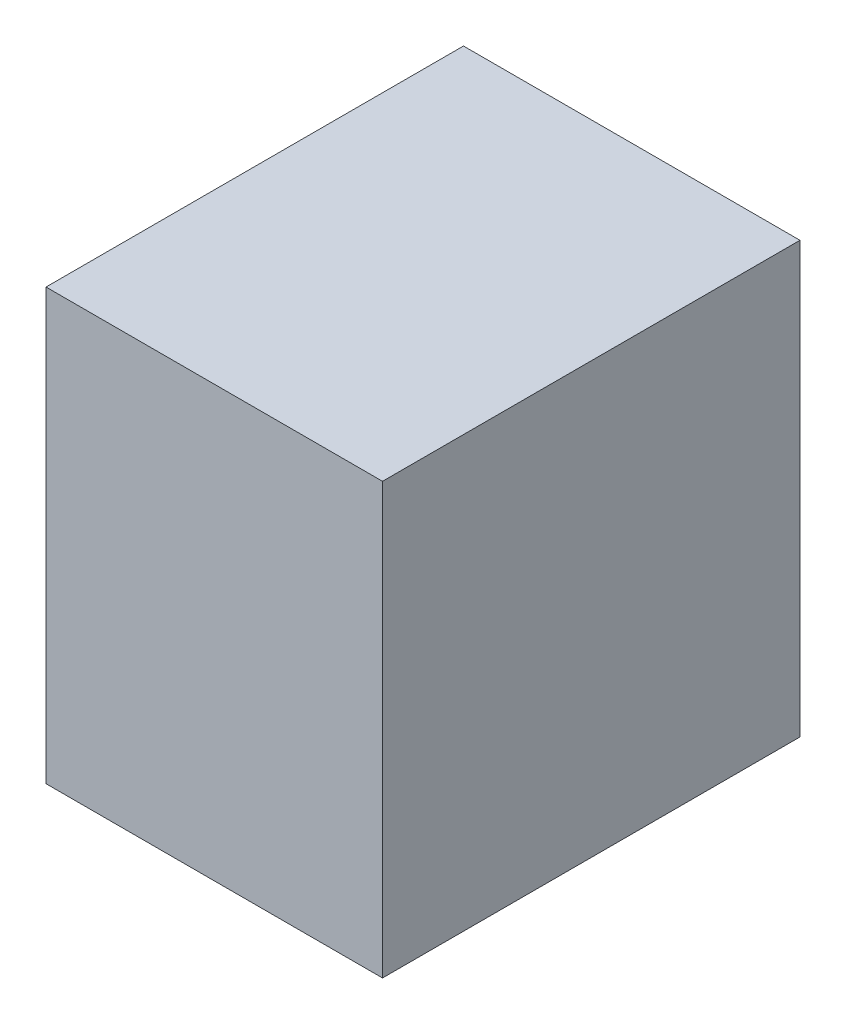
ISO-10303-21;
HEADER;
FILE_DESCRIPTION(('STEP AP214'),'2;1');
FILE_NAME('part.step','',(''),(''),'','','');
FILE_SCHEMA(('AUTOMOTIVE_DESIGN { 1 0 10303 214 1 1 1 1 }'));
ENDSEC;
DATA;
#1=APPLICATION_CONTEXT('core data for automotive mechanical design processes');
#2=APPLICATION_PROTOCOL_DEFINITION('international standard','automotive_design',2000,#1);
#3=PRODUCT_CONTEXT('',#1,'mechanical');
#4=PRODUCT('Part','Part','',(#3));
#5=PRODUCT_RELATED_PRODUCT_CATEGORY('part','',(#4));
#6=PRODUCT_DEFINITION_FORMATION('','',#4);
#7=PRODUCT_DEFINITION_CONTEXT('part definition',#1,'design');
#8=PRODUCT_DEFINITION('design','',#6,#7);
#9=PRODUCT_DEFINITION_SHAPE('','',#8);
#10=(LENGTH_UNIT() NAMED_UNIT(*) SI_UNIT(.MILLI.,.METRE.));
#11=(NAMED_UNIT(*) PLANE_ANGLE_UNIT() SI_UNIT($,.RADIAN.));
#12=(NAMED_UNIT(*) SI_UNIT($,.STERADIAN.) SOLID_ANGLE_UNIT());
#13=UNCERTAINTY_MEASURE_WITH_UNIT(LENGTH_MEASURE(1.E-05),#10,'distance_accuracy_value','');
#14=(GEOMETRIC_REPRESENTATION_CONTEXT(3) GLOBAL_UNCERTAINTY_ASSIGNED_CONTEXT((#13)) GLOBAL_UNIT_ASSIGNED_CONTEXT((#10,
#11,#12)) REPRESENTATION_CONTEXT('',''));
#15=CARTESIAN_POINT('',(0.,0.,0.));
#16=DIRECTION('',(0.,0.,1.));
#17=DIRECTION('',(1.,0.,0.));
#18=AXIS2_PLACEMENT_3D('',#15,#16,#17);
#19=CARTESIAN_POINT('',(0.,0.,0.));
#20=DIRECTION('',(0.,1.,0.));
#21=DIRECTION('',(0.,0.,1.));
#22=AXIS2_PLACEMENT_3D('',#19,#20,#21);
#23=PLANE('',#22);
#24=DIRECTION('',(1.,0.,0.));
#25=VECTOR('',#24,1.);
#26=CARTESIAN_POINT('',(0.,0.,16.1586938369327));
#27=LINE('',#26,#25);
#28=CARTESIAN_POINT('',(-41.0624220629294,0.,16.1586938369327));
#29=VERTEX_POINT('',#28);
#30=CARTESIAN_POINT('',(-21.5061909323463,0.,16.1586938369327));
#31=VERTEX_POINT('',#30);
#32=EDGE_CURVE('E133',#29,#31,#27,.T.);
#33=ORIENTED_EDGE('',*,*,#32,.F.);
#34=DIRECTION('',(0.,0.,1.));
#35=VECTOR('',#34,1.);
#36=CARTESIAN_POINT('',(-41.0624220629294,0.,0.));
#37=LINE('',#36,#35);
#38=CARTESIAN_POINT('',(-41.0624220629294,0.,-8.10330616306728));
#39=VERTEX_POINT('',#38);
#40=EDGE_CURVE('E102',#39,#29,#37,.T.);
#41=ORIENTED_EDGE('',*,*,#40,.F.);
#42=DIRECTION('',(1.,0.,0.));
#43=VECTOR('',#42,1.);
#44=CARTESIAN_POINT('',(0.,0.,-8.10330616306728));
#45=LINE('',#44,#43);
#46=CARTESIAN_POINT('',(-21.5061909323463,0.,-8.10330616306728));
#47=VERTEX_POINT('',#46);
#48=EDGE_CURVE('E139',#39,#47,#45,.T.);
#49=ORIENTED_EDGE('',*,*,#48,.T.);
#50=DIRECTION('',(0.,0.,-1.));
#51=VECTOR('',#50,1.);
#52=CARTESIAN_POINT('',(-21.5061909323463,0.,0.));
#53=LINE('',#52,#51);
#54=EDGE_CURVE('E120',#31,#47,#53,.T.);
#55=ORIENTED_EDGE('',*,*,#54,.F.);
#56=EDGE_LOOP('',(#33,#41,#49,#55));
#57=FACE_BOUND('',#56,.T.);
#58=ADVANCED_FACE('F65',(#57),#23,.F.);
#59=CARTESIAN_POINT('',(-41.0624220629294,25.,0.));
#60=DIRECTION('',(1.,0.,0.));
#61=DIRECTION('',(0.,0.,-1.));
#62=AXIS2_PLACEMENT_3D('',#59,#60,#61);
#63=PLANE('',#62);
#64=ORIENTED_EDGE('',*,*,#40,.T.);
#65=DIRECTION('',(0.,-1.,0.));
#66=VECTOR('',#65,1.);
#67=CARTESIAN_POINT('',(-41.0624220629294,25.,16.1586938369327));
#68=LINE('',#67,#66);
#69=CARTESIAN_POINT('',(-41.0624220629294,25.,16.1586938369327));
#70=VERTEX_POINT('',#69);
#71=EDGE_CURVE('E129',#70,#29,#68,.T.);
#72=ORIENTED_EDGE('',*,*,#71,.F.);
#73=DIRECTION('',(0.,0.,1.));
#74=VECTOR('',#73,1.);
#75=CARTESIAN_POINT('',(-41.0624220629294,25.,0.));
#76=LINE('',#75,#74);
#77=CARTESIAN_POINT('',(-41.0624220629294,25.,-8.10330616306728));
#78=VERTEX_POINT('',#77);
#79=EDGE_CURVE('E83',#78,#70,#76,.T.);
#80=ORIENTED_EDGE('',*,*,#79,.F.);
#81=DIRECTION('',(0.,-1.,0.));
#82=VECTOR('',#81,1.);
#83=CARTESIAN_POINT('',(-41.0624220629294,25.,-8.10330616306728));
#84=LINE('',#83,#82);
#85=EDGE_CURVE('E99',#78,#39,#84,.T.);
#86=ORIENTED_EDGE('',*,*,#85,.T.);
#87=EDGE_LOOP('',(#64,#72,#80,#86));
#88=FACE_BOUND('',#87,.T.);
#89=ADVANCED_FACE('F151',(#88),#63,.F.);
#90=CARTESIAN_POINT('',(0.,25.,-8.10330616306728));
#91=DIRECTION('',(0.,0.,-1.));
#92=DIRECTION('',(-1.,0.,0.));
#93=AXIS2_PLACEMENT_3D('',#90,#91,#92);
#94=PLANE('',#93);
#95=ORIENTED_EDGE('',*,*,#48,.F.);
#96=ORIENTED_EDGE('',*,*,#85,.F.);
#97=DIRECTION('',(1.,0.,0.));
#98=VECTOR('',#97,1.);
#99=CARTESIAN_POINT('',(0.,25.,-8.10330616306728));
#100=LINE('',#99,#98);
#101=CARTESIAN_POINT('',(-21.5061909323463,25.,-8.10330616306728));
#102=VERTEX_POINT('',#101);
#103=EDGE_CURVE('E112',#78,#102,#100,.T.);
#104=ORIENTED_EDGE('',*,*,#103,.T.);
#105=DIRECTION('',(0.,-1.,0.));
#106=VECTOR('',#105,1.);
#107=CARTESIAN_POINT('',(-21.5061909323463,25.,-8.10330616306728));
#108=LINE('',#107,#106);
#109=EDGE_CURVE('E75',#102,#47,#108,.T.);
#110=ORIENTED_EDGE('',*,*,#109,.T.);
#111=EDGE_LOOP('',(#95,#96,#104,#110));
#112=FACE_BOUND('',#111,.T.);
#113=ADVANCED_FACE('F125',(#112),#94,.T.);
#114=CARTESIAN_POINT('',(-21.5061909323463,25.,0.));
#115=DIRECTION('',(-1.,0.,0.));
#116=DIRECTION('',(0.,0.,1.));
#117=AXIS2_PLACEMENT_3D('',#114,#115,#116);
#118=PLANE('',#117);
#119=ORIENTED_EDGE('',*,*,#54,.T.);
#120=ORIENTED_EDGE('',*,*,#109,.F.);
#121=DIRECTION('',(0.,0.,-1.));
#122=VECTOR('',#121,1.);
#123=CARTESIAN_POINT('',(-21.5061909323463,25.,0.));
#124=LINE('',#123,#122);
#125=CARTESIAN_POINT('',(-21.5061909323463,25.,16.1586938369327));
#126=VERTEX_POINT('',#125);
#127=EDGE_CURVE('E109',#126,#102,#124,.T.);
#128=ORIENTED_EDGE('',*,*,#127,.F.);
#129=DIRECTION('',(0.,-1.,0.));
#130=VECTOR('',#129,1.);
#131=CARTESIAN_POINT('',(-21.5061909323463,25.,16.1586938369327));
#132=LINE('',#131,#130);
#133=EDGE_CURVE('E12',#126,#31,#132,.T.);
#134=ORIENTED_EDGE('',*,*,#133,.T.);
#135=EDGE_LOOP('',(#119,#120,#128,#134));
#136=FACE_BOUND('',#135,.T.);
#137=ADVANCED_FACE('F119',(#136),#118,.F.);
#138=CARTESIAN_POINT('',(0.,25.,16.1586938369327));
#139=DIRECTION('',(0.,0.,-1.));
#140=DIRECTION('',(-1.,0.,0.));
#141=AXIS2_PLACEMENT_3D('',#138,#139,#140);
#142=PLANE('',#141);
#143=ORIENTED_EDGE('',*,*,#32,.T.);
#144=ORIENTED_EDGE('',*,*,#133,.F.);
#145=DIRECTION('',(1.,0.,0.));
#146=VECTOR('',#145,1.);
#147=CARTESIAN_POINT('',(0.,25.,16.1586938369327));
#148=LINE('',#147,#146);
#149=EDGE_CURVE('E114',#70,#126,#148,.T.);
#150=ORIENTED_EDGE('',*,*,#149,.F.);
#151=ORIENTED_EDGE('',*,*,#71,.T.);
#152=EDGE_LOOP('',(#143,#144,#150,#151));
#153=FACE_BOUND('',#152,.T.);
#154=ADVANCED_FACE('F67',(#153),#142,.F.);
#155=CARTESIAN_POINT('',(0.,25.,0.));
#156=DIRECTION('',(0.,1.,0.));
#157=DIRECTION('',(0.,0.,1.));
#158=AXIS2_PLACEMENT_3D('',#155,#156,#157);
#159=PLANE('',#158);
#160=ORIENTED_EDGE('',*,*,#149,.T.);
#161=ORIENTED_EDGE('',*,*,#127,.T.);
#162=ORIENTED_EDGE('',*,*,#103,.F.);
#163=ORIENTED_EDGE('',*,*,#79,.T.);
#164=EDGE_LOOP('',(#160,#161,#162,#163));
#165=FACE_BOUND('',#164,.T.);
#166=ADVANCED_FACE('F110',(#165),#159,.T.);
#167=CLOSED_SHELL('',(#58,#89,#113,#137,#154,#166));
#168=MANIFOLD_SOLID_BREP('B2',#167);
#169=ADVANCED_BREP_SHAPE_REPRESENTATION('',(#18,#168),#14);
#170=SHAPE_DEFINITION_REPRESENTATION(#9,#169);
ENDSEC;
END-ISO-10303-21;
